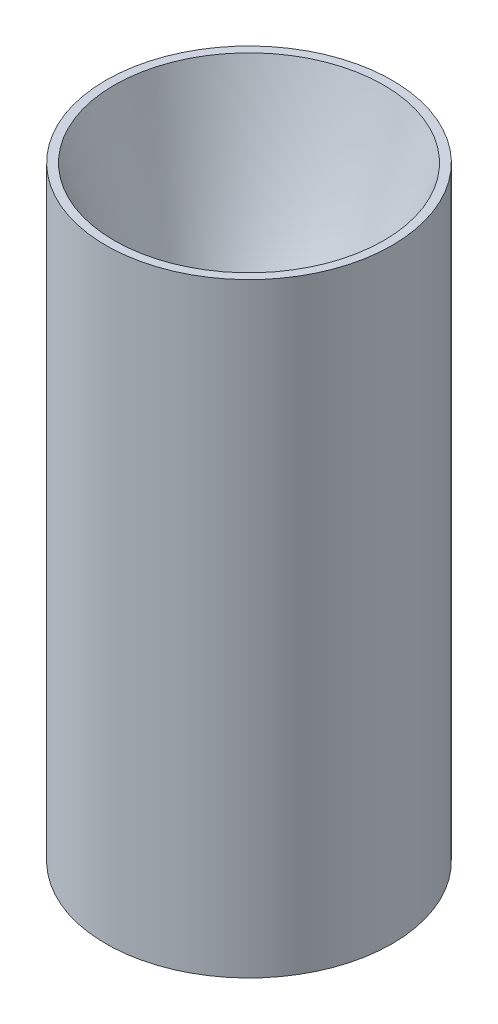
ISO-10303-21;
HEADER;
FILE_DESCRIPTION(('STEP AP214'),'2;1');
FILE_NAME('part.step','',(''),(''),'','','');
FILE_SCHEMA(('AUTOMOTIVE_DESIGN { 1 0 10303 214 1 1 1 1 }'));
ENDSEC;
DATA;
#1=APPLICATION_CONTEXT('core data for automotive mechanical design processes');
#2=APPLICATION_PROTOCOL_DEFINITION('international standard','automotive_design',2000,#1);
#3=PRODUCT_CONTEXT('',#1,'mechanical');
#4=PRODUCT('Part','Part','',(#3));
#5=PRODUCT_RELATED_PRODUCT_CATEGORY('part','',(#4));
#6=PRODUCT_DEFINITION_FORMATION('','',#4);
#7=PRODUCT_DEFINITION_CONTEXT('part definition',#1,'design');
#8=PRODUCT_DEFINITION('design','',#6,#7);
#9=PRODUCT_DEFINITION_SHAPE('','',#8);
#10=(LENGTH_UNIT() NAMED_UNIT(*) SI_UNIT(.MILLI.,.METRE.));
#11=(NAMED_UNIT(*) PLANE_ANGLE_UNIT() SI_UNIT($,.RADIAN.));
#12=(NAMED_UNIT(*) SI_UNIT($,.STERADIAN.) SOLID_ANGLE_UNIT());
#13=UNCERTAINTY_MEASURE_WITH_UNIT(LENGTH_MEASURE(1.E-05),#10,'distance_accuracy_value','');
#14=(GEOMETRIC_REPRESENTATION_CONTEXT(3) GLOBAL_UNCERTAINTY_ASSIGNED_CONTEXT((#13)) GLOBAL_UNIT_ASSIGNED_CONTEXT((#10,
#11,#12)) REPRESENTATION_CONTEXT('',''));
#15=CARTESIAN_POINT('',(0.,0.,0.));
#16=DIRECTION('',(0.,0.,1.));
#17=DIRECTION('',(1.,0.,0.));
#18=AXIS2_PLACEMENT_3D('',#15,#16,#17);
#19=CARTESIAN_POINT('',(26.7952792027638,6.50940032261705,0.));
#20=CARTESIAN_POINT('',(26.7445202608389,6.45863951352258,0.));
#21=CARTESIAN_POINT('',(26.6704420702071,6.38228245129657,0.));
#22=CARTESIAN_POINT('',(26.5045552478799,6.20880231838131,0.));
#23=CARTESIAN_POINT('',(26.3663457558084,6.0501123088261,0.));
#24=CARTESIAN_POINT('',(26.1788763741962,5.83307431955689,0.));
#25=CARTESIAN_POINT('',(26.0044054743904,5.61088821502492,0.));
#26=CARTESIAN_POINT('',(25.7917882699891,5.32567960819241,0.));
#27=CARTESIAN_POINT('',(25.6025147209982,5.0458645334822,0.));
#28=CARTESIAN_POINT('',(25.41648850457,4.75146224774109,0.));
#29=CARTESIAN_POINT('',(25.2460122224941,4.45494379501456,0.));
#30=CARTESIAN_POINT('',(25.0840703005529,4.14944285659226,0.));
#31=CARTESIAN_POINT('',(24.935285976811,3.8398274049797,0.));
#32=CARTESIAN_POINT('',(24.7971967711735,3.52378782945289,0.));
#33=CARTESIAN_POINT('',(24.6716190705559,3.20350771325653,0.));
#34=CARTESIAN_POINT('',(24.5577414131155,2.87825331698411,0.));
#35=CARTESIAN_POINT('',(24.4563235712815,2.54940009295196,0.));
#36=CARTESIAN_POINT('',(24.3671416013245,2.21651509223236,0.));
#37=CARTESIAN_POINT('',(24.2905437014453,1.88115744920019,0.));
#38=CARTESIAN_POINT('',(24.2264993053653,1.54221117006489,0.));
#39=CARTESIAN_POINT('',(24.1751847188441,1.20269794512489,0.));
#40=CARTESIAN_POINT('',(24.1414350870908,0.90159400009664,0.));
#41=CARTESIAN_POINT('',(24.1205335987741,0.646924938525799,0.));
#42=CARTESIAN_POINT('',(24.1084615678794,0.427224789349872,0.));
#43=CARTESIAN_POINT('',(24.1020237227721,0.267801741635842,0.));
#44=CARTESIAN_POINT('',(24.099606331446,0.110274361763279,0.));
#45=CARTESIAN_POINT('',(24.0990685004946,0.0360533244193808,0.));
#46=CARTESIAN_POINT('',(24.0990678740505,0.000160672239889663,0.));
#47=B_SPLINE_CURVE_WITH_KNOTS('',4,(#19,#20,#21,#22,#23,#24,#25,#26,#27,#28,#29,#30,#31,#32,#33,
#34,#35,#36,#37,#38,#39,#40,#41,#42,#43,#44,#45,#46),.UNSPECIFIED.,.F.,.F.,(5,1,1,1,1,1,1,1,1,1,
1,1,1,1,1,1,1,1,1,1,1,1,1,1,5),(0.0825688161645696,0.122284452541055,0.142142270729318,
0.162000088917581,0.201715725294151,0.241431361670644,0.281146998047181,0.320862634423759,
0.360578270800262,0.400293907176806,0.440009543553384,0.479725179929891,0.519440816306429,
0.55915645268299,0.598872089059496,0.638587725436031,0.678303361812587,0.718018998189109,
0.75773463456565,0.797450270942201,0.837165907318734,0.857023725507005,0.876881543695275,
0.896739361883545,0.916597180071815),.UNSPECIFIED.);
#48=CARTESIAN_POINT('',(-0.00553212594954357,165.815985113531,0.));
#49=DIRECTION('',(0.,1.,0.));
#50=AXIS1_PLACEMENT('',#48,#49);
#51=SURFACE_OF_REVOLUTION('',#47,#50);
#52=CARTESIAN_POINT('',(-0.00553212594953341,0.000160668663540253,0.));
#53=DIRECTION('',(0.,1.,0.));
#54=DIRECTION('',(-1.,0.,0.));
#55=AXIS2_PLACEMENT_3D('',#52,#53,#54);
#56=CIRCLE('',#55,24.1046000000004);
#57=CARTESIAN_POINT('',(-24.1101321259499,0.000160668663538777,0.));
#58=VERTEX_POINT('',#57);
#59=EDGE_CURVE('E11',#58,#58,#56,.T.);
#60=ORIENTED_EDGE('',*,*,#59,.F.);
#61=EDGE_LOOP('',(#60));
#62=FACE_BOUND('',#61,.T.);
#63=CARTESIAN_POINT('',(-0.00553212594953381,6.50940032262817,0.));
#64=DIRECTION('',(0.,1.,0.));
#65=DIRECTION('',(-1.,0.,0.));
#66=AXIS2_PLACEMENT_3D('',#63,#64,#65);
#67=CIRCLE('',#66,26.8008113287013);
#68=CARTESIAN_POINT('',(-26.8063434546508,6.50940032262817,0.));
#69=VERTEX_POINT('',#68);
#70=EDGE_CURVE('E133',#69,#69,#67,.T.);
#71=ORIENTED_EDGE('',*,*,#70,.T.);
#72=EDGE_LOOP('',(#71));
#73=FACE_BOUND('',#72,.T.);
#74=ADVANCED_FACE('F39',(#62,#73),#51,.T.);
#75=CARTESIAN_POINT('',(24.0990678740508,0.000160668663551339,0.));
#76=CARTESIAN_POINT('',(24.0990691047269,-0.070367973878569,0.));
#77=CARTESIAN_POINT('',(24.099598251825,-0.213423516507926,0.));
#78=CARTESIAN_POINT('',(24.101973936858,-0.543022242706955,0.));
#79=CARTESIAN_POINT('',(24.1082983309105,-0.823999723448026,0.));
#80=CARTESIAN_POINT('',(24.1177834518181,-1.19466139837465,0.));
#81=CARTESIAN_POINT('',(24.1304257444827,-1.51327438499646,0.));
#82=CARTESIAN_POINT('',(24.1462259682204,-1.86177892994199,0.));
#83=CARTESIAN_POINT('',(24.1651812265647,-2.19354619851658,0.));
#84=CARTESIAN_POINT('',(24.1928188405006,-2.61790872671156,0.));
#85=CARTESIAN_POINT('',(24.2322870469807,-3.12187327370256,0.));
#86=CARTESIAN_POINT('',(24.3032997069456,-3.87981800198978,0.));
#87=CARTESIAN_POINT('',(24.4231266778326,-4.88628971555583,0.));
#88=CARTESIAN_POINT('',(24.5994860436667,-6.05655008815833,0.));
#89=CARTESIAN_POINT('',(24.850885232735,-7.38500574321532,0.));
#90=CARTESIAN_POINT('',(25.1517953131182,-8.7034138436264,0.));
#91=CARTESIAN_POINT('',(25.5017706231745,-10.0094765385454,0.));
#92=CARTESIAN_POINT('',(25.9003609832821,-11.3016589275196,0.));
#93=CARTESIAN_POINT('',(26.3469453916183,-12.5779386667968,0.));
#94=CARTESIAN_POINT('',(26.8410033226009,-13.8367268169819,0.));
#95=CARTESIAN_POINT('',(27.3816731217584,-15.0760364630132,0.));
#96=CARTESIAN_POINT('',(27.9684793865051,-16.2944491293409,0.));
#97=CARTESIAN_POINT('',(28.600139397597,-17.4897781309074,0.));
#98=CARTESIAN_POINT('',(29.2765323958535,-18.6611270955555,0.));
#99=CARTESIAN_POINT('',(29.9954451018809,-19.8055827366556,0.));
#100=CARTESIAN_POINT('',(30.7580219994662,-20.9236994166732,0.));
#101=CARTESIAN_POINT('',(31.459167192691,-21.8742511037876,0.));
#102=CARTESIAN_POINT('',(32.088736123084,-22.6732848254345,0.));
#103=CARTESIAN_POINT('',(32.6241284164947,-23.3202614844282,0.));
#104=CARTESIAN_POINT('',(33.0722557681744,-23.8398443637357,0.));
#105=CARTESIAN_POINT('',(33.508450026224,-24.3296555944729,0.));
#106=CARTESIAN_POINT('',(33.9358261214135,-24.7883237390149,0.));
#107=CARTESIAN_POINT('',(34.2455586398419,-25.1137076601529,0.));
#108=CARTESIAN_POINT('',(34.5368599576458,-25.4094883974469,0.));
#109=CARTESIAN_POINT('',(34.6364124255998,-25.5097892829585,0.));
#110=CARTESIAN_POINT('',(34.6862828033089,-25.5596614680671,0.));
#111=B_SPLINE_CURVE_WITH_KNOTS('',4,(#75,#76,#77,#78,#79,#80,#81,#82,#83,#84,#85,#86,#87,#88,
#89,#90,#91,#92,#93,#94,#95,#96,#97,#98,#99,#100,#101,#102,#103,#104,#105,#106,#107,#108,#109,
#110),.UNSPECIFIED.,.F.,.F.,(5,1,1,1,1,1,1,1,1,1,1,1,1,1,1,1,1,1,1,1,1,1,1,1,1,1,1,1,1,1,1,1,5),
(0.0826377293913405,0.0925749264345495,0.10251212335078,0.11244932026701,0.122386517183241,
0.132323714099471,0.142260911015702,0.152198107931932,0.162135304848163,0.182009698680624,
0.201884092513085,0.241632880178006,0.281381667842927,0.321130455507848,0.360879243172768,
0.400628030837689,0.44037681850261,0.480125606167531,0.519874393832452,0.559623181497373,
0.599371969162294,0.639120756827214,0.678869544492136,0.718618332157059,0.758367119821983,
0.798115907486907,0.817990301319368,0.837864695151829,0.857739088984291,0.877613482816753,
0.897487876649217,0.907425073565449,0.917362270352413),.UNSPECIFIED.);
#112=CARTESIAN_POINT('',(-0.00553212594954357,165.815985113531,0.));
#113=DIRECTION('',(0.,1.,0.));
#114=AXIS1_PLACEMENT('',#112,#113);
#115=SURFACE_OF_REVOLUTION('',#111,#114);
#116=CARTESIAN_POINT('',(-0.00553212594953185,-25.5596614655478,0.));
#117=DIRECTION('',(0.,1.,0.));
#118=DIRECTION('',(-1.,0.,0.));
#119=AXIS2_PLACEMENT_3D('',#116,#117,#118);
#120=CIRCLE('',#119,34.6918149267067);
#121=CARTESIAN_POINT('',(-34.6973470526563,-25.5596614655478,0.));
#122=VERTEX_POINT('',#121);
#123=EDGE_CURVE('E48',#122,#122,#120,.T.);
#124=ORIENTED_EDGE('',*,*,#123,.F.);
#125=EDGE_LOOP('',(#124));
#126=FACE_BOUND('',#125,.T.);
#127=ORIENTED_EDGE('',*,*,#59,.T.);
#128=EDGE_LOOP('',(#127));
#129=FACE_BOUND('',#128,.T.);
#130=ADVANCED_FACE('F152',(#126,#129),#115,.T.);
#131=CARTESIAN_POINT('',(-0.00553212594953185,-25.5596614655478,0.));
#132=DIRECTION('',(0.,-1.,0.));
#133=DIRECTION('',(1.,0.,0.));
#134=AXIS2_PLACEMENT_3D('',#131,#132,#133);
#135=CONICAL_SURFACE('',#134,34.6918149267067,0.785398163436937);
#136=CARTESIAN_POINT('',(-0.00553212594953132,-34.1672896560324,0.));
#137=DIRECTION('',(0.,1.,0.));
#138=DIRECTION('',(-1.,0.,0.));
#139=AXIS2_PLACEMENT_3D('',#136,#137,#138);
#140=CIRCLE('',#139,43.2994431178712);
#141=CARTESIAN_POINT('',(-43.3049752438207,-34.1672896560324,0.));
#142=VERTEX_POINT('',#141);
#143=EDGE_CURVE('E210',#142,#142,#140,.T.);
#144=ORIENTED_EDGE('',*,*,#143,.F.);
#145=EDGE_LOOP('',(#144));
#146=FACE_BOUND('',#145,.T.);
#147=ORIENTED_EDGE('',*,*,#123,.T.);
#148=EDGE_LOOP('',(#147));
#149=FACE_BOUND('',#148,.T.);
#150=ADVANCED_FACE('F155',(#146,#149),#135,.F.);
#151=CARTESIAN_POINT('',(43.2939109919216,-34.1672896560324,0.));
#152=CARTESIAN_POINT('',(43.3437831509401,-34.2171620547876,0.));
#153=CARTESIAN_POINT('',(43.4443920723685,-34.3185162872671,0.));
#154=CARTESIAN_POINT('',(43.6740724061853,-34.5515494504386,0.));
#155=CARTESIAN_POINT('',(43.8739246239184,-34.7603401507577,0.));
#156=CARTESIAN_POINT('',(44.1814575025702,-35.0846311847488,0.));
#157=CARTESIAN_POINT('',(44.5147761894283,-35.446992656778,0.));
#158=CARTESIAN_POINT('',(44.915126947852,-35.8942476322047,0.));
#159=CARTESIAN_POINT('',(45.3528176802111,-36.4033812816733,0.));
#160=CARTESIAN_POINT('',(45.8935379369539,-37.0556721220805,0.));
#161=CARTESIAN_POINT('',(46.5198690600385,-37.8514517846419,0.));
#162=CARTESIAN_POINT('',(47.2231021376954,-38.8040762386625,0.));
#163=CARTESIAN_POINT('',(47.9844755193302,-39.9209726566969,0.));
#164=CARTESIAN_POINT('',(48.7041252285222,-41.0661548784852,0.));
#165=CARTESIAN_POINT('',(49.3801202302703,-42.2370932384946,0.));
#166=CARTESIAN_POINT('',(50.01206092747,-43.4327015254174,0.));
#167=CARTESIAN_POINT('',(50.5987337523159,-44.6509688031028,0.));
#168=CARTESIAN_POINT('',(51.1395203606863,-45.8904084049121,0.));
#169=CARTESIAN_POINT('',(51.6335378307226,-47.1491350666163,0.));
#170=CARTESIAN_POINT('',(52.0243487389992,-48.2659692231615,0.));
#171=CARTESIAN_POINT('',(52.3292893400894,-49.2330777397246,0.));
#172=CARTESIAN_POINT('',(52.6100142241289,-50.2074890377158,0.));
#173=CARTESIAN_POINT('',(52.8663751201,-51.1885390829049,0.));
#174=CARTESIAN_POINT('',(53.0920641867515,-52.1774428208328,0.));
#175=CARTESIAN_POINT('',(53.2868108220631,-53.1724252392928,0.));
#176=CARTESIAN_POINT('',(53.4566757862058,-54.1724354297311,0.));
#177=CARTESIAN_POINT('',(53.5774268612799,-55.0081658598712,0.));
#178=CARTESIAN_POINT('',(53.6772884516445,-55.8484803652905,0.));
#179=CARTESIAN_POINT('',(53.7561931213628,-56.6879981646496,0.));
#180=CARTESIAN_POINT('',(53.8004052845922,-57.2809598986136,0.));
#181=CARTESIAN_POINT('',(53.8304176255593,-57.7815944421289,0.));
#182=CARTESIAN_POINT('',(53.85016845335,-58.2128376212103,0.));
#183=CARTESIAN_POINT('',(53.8628113509135,-58.5325674871425,0.));
#184=CARTESIAN_POINT('',(53.8722968379942,-58.904795492133,0.));
#185=CARTESIAN_POINT('',(53.8786214368583,-59.1815646159098,0.));
#186=CARTESIAN_POINT('',(53.8809972871415,-59.5154061023805,0.));
#187=CARTESIAN_POINT('',(53.8815264301106,-59.656983156036,0.));
#188=CARTESIAN_POINT('',(53.8815276614593,-59.7275132092136,0.));
#189=B_SPLINE_CURVE_WITH_KNOTS('',4,(#151,#152,#153,#154,#155,#156,#157,#158,#159,#160,#161,
#162,#163,#164,#165,#166,#167,#168,#169,#170,#171,#172,#173,#174,#175,#176,#177,#178,#179,#180,
#181,#182,#183,#184,#185,#186,#187,#188),.UNSPECIFIED.,.F.,.F.,(5,1,1,1,1,1,1,1,1,1,1,1,1,1,1,1,
1,1,1,1,1,1,1,1,1,1,1,1,1,1,1,1,1,1,5),(0.0826377290567819,0.0925749255159742,0.102512122432206,
0.112449319348439,0.122386516264671,0.142260910097132,0.162135303929593,0.182009697762054,
0.201884091594514,0.241632879259436,0.281381666924358,0.321130454589279,0.3608792422542,
0.400628029919122,0.440376817584044,0.480125605248966,0.519874392913887,0.559623180578807,
0.599371968243729,0.61924636207619,0.639120755908651,0.678869543573573,0.718618331238494,
0.738492725070955,0.758367118903416,0.798115906568337,0.817990300400798,0.837864694233258,
0.857739088065719,0.86767628498195,0.87761348189818,0.887550678814411,0.897487875730641,
0.907425072646872,0.917362270024638),.UNSPECIFIED.);
#190=CARTESIAN_POINT('',(-0.00553212594954357,165.815985113531,0.));
#191=DIRECTION('',(0.,1.,0.));
#192=AXIS1_PLACEMENT('',#190,#191);
#193=SURFACE_OF_REVOLUTION('',#189,#192);
#194=CARTESIAN_POINT('',(-0.00553212594952976,-59.7275132222084,0.));
#195=DIRECTION('',(0.,1.,0.));
#196=DIRECTION('',(-1.,0.,0.));
#197=AXIS2_PLACEMENT_3D('',#194,#195,#196);
#198=CIRCLE('',#197,53.8870597874087);
#199=CARTESIAN_POINT('',(-53.8925919133582,-59.7275132222084,0.));
#200=VERTEX_POINT('',#199);
#201=EDGE_CURVE('E207',#200,#200,#198,.T.);
#202=ORIENTED_EDGE('',*,*,#201,.F.);
#203=EDGE_LOOP('',(#202));
#204=FACE_BOUND('',#203,.T.);
#205=ORIENTED_EDGE('',*,*,#143,.T.);
#206=EDGE_LOOP('',(#205));
#207=FACE_BOUND('',#206,.T.);
#208=ADVANCED_FACE('F159',(#204,#207),#193,.T.);
#209=CARTESIAN_POINT('',(-0.00553212594954357,165.815985113531,0.));
#210=DIRECTION('',(0.,1.,0.));
#211=DIRECTION('',(-1.,0.,0.));
#212=AXIS2_PLACEMENT_3D('',#209,#210,#211);
#213=CYLINDRICAL_SURFACE('',#212,53.8870597874087);
#214=CARTESIAN_POINT('',(-0.00553212594952042,-212.127513222208,0.));
#215=DIRECTION('',(0.,1.,0.));
#216=DIRECTION('',(-1.,0.,0.));
#217=AXIS2_PLACEMENT_3D('',#214,#215,#216);
#218=CIRCLE('',#217,53.8870597874087);
#219=CARTESIAN_POINT('',(-53.8925919133582,-212.127513222208,0.));
#220=VERTEX_POINT('',#219);
#221=EDGE_CURVE('E204',#220,#220,#218,.T.);
#222=ORIENTED_EDGE('',*,*,#221,.F.);
#223=EDGE_LOOP('',(#222));
#224=FACE_BOUND('',#223,.T.);
#225=ORIENTED_EDGE('',*,*,#201,.T.);
#226=EDGE_LOOP('',(#225));
#227=FACE_BOUND('',#226,.T.);
#228=ADVANCED_FACE('F163',(#224,#227),#213,.F.);
#229=CARTESIAN_POINT('',(76.1944678740507,-212.127513222208,0.));
#230=DIRECTION('',(0.,1.,0.));
#231=DIRECTION('',(-1.,0.,0.));
#232=AXIS2_PLACEMENT_3D('',#229,#230,#231);
#233=PLANE('',#232);
#234=CARTESIAN_POINT('',(-60.2370592497475,-212.127513222208,24.9506852198973));
#235=DIRECTION('',(0.,-1.,0.));
#236=DIRECTION('',(0.,0.,-1.));
#237=AXIS2_PLACEMENT_3D('',#234,#235,#236);
#238=CIRCLE('',#237,3.17499999999999);
#239=CARTESIAN_POINT('',(-60.2370592497475,-212.127513222208,21.7756852198974));
#240=VERTEX_POINT('',#239);
#241=EDGE_CURVE('E91',#240,#240,#238,.T.);
#242=ORIENTED_EDGE('',*,*,#241,.F.);
#243=EDGE_LOOP('',(#242));
#244=FACE_BOUND('',#243,.T.);
#245=CARTESIAN_POINT('',(60.236831783612,-212.127513222208,-24.9512343717267));
#246=DIRECTION('',(0.,-1.,0.));
#247=DIRECTION('',(0.,0.,-1.));
#248=AXIS2_PLACEMENT_3D('',#245,#246,#247);
#249=CIRCLE('',#248,3.17499999999998);
#250=CARTESIAN_POINT('',(60.236831783612,-212.127513222208,-28.1262343717266));
#251=VERTEX_POINT('',#250);
#252=EDGE_CURVE('E90',#251,#251,#249,.T.);
#253=ORIENTED_EDGE('',*,*,#252,.F.);
#254=EDGE_LOOP('',(#253));
#255=FACE_BOUND('',#254,.T.);
#256=CARTESIAN_POINT('',(46.1032838079609,-212.127513222208,46.1035512337718));
#257=DIRECTION('',(0.,1.,0.));
#258=DIRECTION('',(0.38268343232144,0.,-0.923879532529367));
#259=AXIS2_PLACEMENT_3D('',#256,#257,#258);
#260=ELLIPSE('',#259,4.21640000033001,4.21639999999999);
#261=CARTESIAN_POINT('',(47.7168302321273,-212.127513222208,42.20810557251));
#262=VERTEX_POINT('',#261);
#263=EDGE_CURVE('E43',#262,#262,#260,.T.);
#264=ORIENTED_EDGE('',*,*,#263,.T.);
#265=EDGE_LOOP('',(#264));
#266=FACE_BOUND('',#265,.T.);
#267=CARTESIAN_POINT('',(-0.000267431971473179,-212.127513222208,65.2002674406839));
#268=DIRECTION('',(0.,1.,0.));
#269=DIRECTION('',(0.707106781139304,0.,-0.707106781233791));
#270=AXIS2_PLACEMENT_3D('',#267,#268,#269);
#271=ELLIPSE('',#270,4.21640000112674,4.21639999999999);
#272=CARTESIAN_POINT('',(2.98117760082102,-212.127513222208,62.2188224074931));
#273=VERTEX_POINT('',#272);
#274=EDGE_CURVE('E107',#273,#273,#271,.T.);
#275=ORIENTED_EDGE('',*,*,#274,.T.);
#276=EDGE_LOOP('',(#275));
#277=FACE_BOUND('',#276,.T.);
#278=CARTESIAN_POINT('',(-46.1038186893277,-212.127513222208,46.1035512511962));
#279=DIRECTION('',(0.,1.,0.));
#280=DIRECTION('',(0.923879532493207,0.,-0.382683432408738));
#281=AXIS2_PLACEMENT_3D('',#278,#279,#280);
#282=ELLIPSE('',#281,4.21640000192348,4.21639999999999);
#283=CARTESIAN_POINT('',(-42.2083730267463,-212.127513222208,44.4900048260519));
#284=VERTEX_POINT('',#283);
#285=EDGE_CURVE('E111',#284,#284,#282,.T.);
#286=ORIENTED_EDGE('',*,*,#285,.T.);
#287=EDGE_LOOP('',(#286));
#288=FACE_BOUND('',#287,.T.);
#289=CARTESIAN_POINT('',(-65.2005348987914,-212.127513222208,0.));
#290=DIRECTION('',(0.,1.,0.));
#291=DIRECTION('',(1.,0.,0.));
#292=AXIS2_PLACEMENT_3D('',#289,#290,#291);
#293=ELLIPSE('',#292,4.21640000225349,4.21639999999999);
#294=CARTESIAN_POINT('',(-60.9841348965379,-212.127513222208,0.));
#295=VERTEX_POINT('',#294);
#296=EDGE_CURVE('E115',#295,#295,#293,.T.);
#297=ORIENTED_EDGE('',*,*,#296,.T.);
#298=EDGE_LOOP('',(#297));
#299=FACE_BOUND('',#298,.T.);
#300=CARTESIAN_POINT('',(-46.1038186893284,-212.127513222208,-46.1035512511956));
#301=DIRECTION('',(0.,1.,0.));
#302=DIRECTION('',(0.92387953249321,0.,0.382683432408731));
#303=AXIS2_PLACEMENT_3D('',#300,#301,#302);
#304=ELLIPSE('',#303,4.21640000192348,4.21639999999999);
#305=CARTESIAN_POINT('',(-42.2083730267469,-212.127513222208,-44.4900048260513));
#306=VERTEX_POINT('',#305);
#307=EDGE_CURVE('E119',#306,#306,#304,.T.);
#308=ORIENTED_EDGE('',*,*,#307,.T.);
#309=EDGE_LOOP('',(#308));
#310=FACE_BOUND('',#309,.T.);
#311=CARTESIAN_POINT('',(-0.000267431972383761,-212.127513222208,-65.2002674406839));
#312=DIRECTION('',(0.,1.,0.));
#313=DIRECTION('',(0.707106781139309,0.,0.707106781233786));
#314=AXIS2_PLACEMENT_3D('',#311,#312,#313);
#315=ELLIPSE('',#314,4.21640000112674,4.21639999999999);
#316=CARTESIAN_POINT('',(2.98117760082012,-212.127513222208,-62.2188224074931));
#317=VERTEX_POINT('',#316);
#318=EDGE_CURVE('E123',#317,#317,#315,.T.);
#319=ORIENTED_EDGE('',*,*,#318,.T.);
#320=EDGE_LOOP('',(#319));
#321=FACE_BOUND('',#320,.T.);
#322=CARTESIAN_POINT('',(46.1032838079602,-212.127513222208,-46.1035512337724));
#323=DIRECTION('',(0.,1.,0.));
#324=DIRECTION('',(0.382683432321446,0.,0.923879532529364));
#325=AXIS2_PLACEMENT_3D('',#322,#323,#324);
#326=ELLIPSE('',#325,4.21640000033001,4.21639999999999);
#327=CARTESIAN_POINT('',(47.7168302321267,-212.127513222208,-42.2081055725107));
#328=VERTEX_POINT('',#327);
#329=EDGE_CURVE('E127',#328,#328,#326,.T.);
#330=ORIENTED_EDGE('',*,*,#329,.T.);
#331=EDGE_LOOP('',(#330));
#332=FACE_BOUND('',#331,.T.);
#333=CARTESIAN_POINT('',(65.2,-212.127513222208,0.));
#334=DIRECTION('',(0.,-1.,0.));
#335=DIRECTION('',(0.,0.,-1.));
#336=AXIS2_PLACEMENT_3D('',#333,#334,#335);
#337=CIRCLE('',#336,4.21639999999999);
#338=CARTESIAN_POINT('',(65.2,-212.127513222208,-4.21639999999999));
#339=VERTEX_POINT('',#338);
#340=EDGE_CURVE('E128',#339,#339,#337,.T.);
#341=ORIENTED_EDGE('',*,*,#340,.F.);
#342=EDGE_LOOP('',(#341));
#343=FACE_BOUND('',#342,.T.);
#344=CARTESIAN_POINT('',(-0.00553212594952042,-212.127513222208,0.));
#345=DIRECTION('',(0.,1.,0.));
#346=DIRECTION('',(-1.,0.,0.));
#347=AXIS2_PLACEMENT_3D('',#344,#345,#346);
#348=CIRCLE('',#347,76.2000000000002);
#349=CARTESIAN_POINT('',(-76.2055321259497,-212.127513222208,0.));
#350=VERTEX_POINT('',#349);
#351=EDGE_CURVE('E201',#350,#350,#348,.T.);
#352=ORIENTED_EDGE('',*,*,#351,.F.);
#353=EDGE_LOOP('',(#352));
#354=FACE_BOUND('',#353,.T.);
#355=ORIENTED_EDGE('',*,*,#221,.T.);
#356=EDGE_LOOP('',(#355));
#357=FACE_BOUND('',#356,.T.);
#358=ADVANCED_FACE('F167',(#244,#255,#266,#277,#288,#299,#310,#321,#332,#343,#354,#357),#233,.F.);
#359=CARTESIAN_POINT('',(-0.00553212594954357,165.815985113531,0.));
#360=DIRECTION('',(0.,1.,0.));
#361=DIRECTION('',(-1.,0.,0.));
#362=AXIS2_PLACEMENT_3D('',#359,#360,#361);
#363=CYLINDRICAL_SURFACE('',#362,76.2000000000002);
#364=CARTESIAN_POINT('',(-0.00553212594954014,109.927507640521,0.));
#365=DIRECTION('',(0.,1.,0.));
#366=DIRECTION('',(-1.,0.,0.));
#367=AXIS2_PLACEMENT_3D('',#364,#365,#366);
#368=CIRCLE('',#367,76.2000000000002);
#369=CARTESIAN_POINT('',(-76.2055321259497,109.927507640521,0.));
#370=VERTEX_POINT('',#369);
#371=EDGE_CURVE('E198',#370,#370,#368,.T.);
#372=ORIENTED_EDGE('',*,*,#371,.F.);
#373=EDGE_LOOP('',(#372));
#374=FACE_BOUND('',#373,.T.);
#375=ORIENTED_EDGE('',*,*,#351,.T.);
#376=EDGE_LOOP('',(#375));
#377=FACE_BOUND('',#376,.T.);
#378=ADVANCED_FACE('F171',(#374,#377),#363,.T.);
#379=CARTESIAN_POINT('',(71.7275236023104,109.927507640521,0.));
#380=DIRECTION('',(0.,-1.,0.));
#381=DIRECTION('',(1.,0.,0.));
#382=AXIS2_PLACEMENT_3D('',#379,#380,#381);
#383=PLANE('',#382);
#384=CARTESIAN_POINT('',(-0.00553212594954014,109.927507640521,0.));
#385=DIRECTION('',(0.,1.,0.));
#386=DIRECTION('',(-1.,0.,0.));
#387=AXIS2_PLACEMENT_3D('',#384,#385,#386);
#388=CIRCLE('',#387,71.7330557282631);
#389=CARTESIAN_POINT('',(-71.7385878542127,109.927507640521,0.));
#390=VERTEX_POINT('',#389);
#391=EDGE_CURVE('E195',#390,#390,#388,.T.);
#392=ORIENTED_EDGE('',*,*,#391,.F.);
#393=EDGE_LOOP('',(#392));
#394=FACE_BOUND('',#393,.T.);
#395=ORIENTED_EDGE('',*,*,#371,.T.);
#396=EDGE_LOOP('',(#395));
#397=FACE_BOUND('',#396,.T.);
#398=ADVANCED_FACE('F175',(#394,#397),#383,.F.);
#399=CARTESIAN_POINT('',(71.7275236023136,109.927507640521,0.));
#400=CARTESIAN_POINT('',(49.2614014026326,34.6361148417871,0.));
#401=CARTESIAN_POINT('',(26.7952792027517,6.50940032262818,0.));
#402=B_SPLINE_CURVE_WITH_KNOTS('',2,(#399,#400,#401),.UNSPECIFIED.,.F.,.F.,(3,3),(0.,1.),.UNSPECIFIED.);
#403=CARTESIAN_POINT('',(-0.00553212594954357,165.815985113531,0.));
#404=DIRECTION('',(0.,1.,0.));
#405=AXIS1_PLACEMENT('',#403,#404);
#406=SURFACE_OF_REVOLUTION('',#402,#405);
#407=ORIENTED_EDGE('',*,*,#70,.F.);
#408=EDGE_LOOP('',(#407));
#409=FACE_BOUND('',#408,.T.);
#410=ORIENTED_EDGE('',*,*,#391,.T.);
#411=EDGE_LOOP('',(#410));
#412=FACE_BOUND('',#411,.T.);
#413=ADVANCED_FACE('F179',(#409,#412),#406,.T.);
#414=CARTESIAN_POINT('',(65.2,-187.127513222208,0.));
#415=DIRECTION('',(0.,-1.,0.));
#416=DIRECTION('',(0.,0.,-1.));
#417=AXIS2_PLACEMENT_3D('',#414,#415,#416);
#418=CONICAL_SURFACE('',#417,4.21639999999999,1.02974425867665);
#419=CARTESIAN_POINT('',(65.2,-184.594044508141,0.));
#420=VERTEX_POINT('',#419);
#421=VERTEX_LOOP('',#420);
#422=FACE_BOUND('',#421,.T.);
#423=CARTESIAN_POINT('',(65.2,-187.127513222208,0.));
#424=DIRECTION('',(0.,-1.,0.));
#425=DIRECTION('',(0.,0.,-1.));
#426=AXIS2_PLACEMENT_3D('',#423,#424,#425);
#427=CIRCLE('',#426,4.21639999999999);
#428=CARTESIAN_POINT('',(65.2,-187.127513222208,-4.21639999999999));
#429=VERTEX_POINT('',#428);
#430=EDGE_CURVE('E131',#429,#429,#427,.T.);
#431=ORIENTED_EDGE('',*,*,#430,.T.);
#432=EDGE_LOOP('',(#431));
#433=FACE_BOUND('',#432,.T.);
#434=ADVANCED_FACE('F183',(#422,#433),#418,.F.);
#435=CARTESIAN_POINT('',(65.2,-212.127513222208,0.));
#436=DIRECTION('',(0.,-1.,0.));
#437=DIRECTION('',(0.,0.,-1.));
#438=AXIS2_PLACEMENT_3D('',#435,#436,#437);
#439=CYLINDRICAL_SURFACE('',#438,4.21639999999999);
#440=ORIENTED_EDGE('',*,*,#430,.F.);
#441=EDGE_LOOP('',(#440));
#442=FACE_BOUND('',#441,.T.);
#443=ORIENTED_EDGE('',*,*,#340,.T.);
#444=EDGE_LOOP('',(#443));
#445=FACE_BOUND('',#444,.T.);
#446=ADVANCED_FACE('F314',(#442,#445),#439,.F.);
#447=CARTESIAN_POINT('',(46.1032838094549,-212.127825399818,-46.1035512301639));
#448=DIRECTION('',(4.78798051518147E-06,-0.99999999992173,1.15592074975258E-05));
#449=DIRECTION('',(0.,-1.15592074976583E-05,-0.999999999933193));
#450=AXIS2_PLACEMENT_3D('',#447,#448,#449);
#451=CYLINDRICAL_SURFACE('',#450,4.21639999999999);
#452=CARTESIAN_POINT('',(46.103164109942,-187.127825401775,-46.1038402103513));
#453=DIRECTION('',(4.78798051518147E-06,-0.99999999992173,1.15592074975258E-05));
#454=DIRECTION('',(0.,-1.15592074976583E-05,-0.999999999933193));
#455=AXIS2_PLACEMENT_3D('',#452,#453,#454);
#456=CIRCLE('',#455,4.2164);
#457=CARTESIAN_POINT('',(46.103164109942,-187.127874140018,-50.3202402100696));
#458=VERTEX_POINT('',#457);
#459=EDGE_CURVE('E124',#458,#458,#456,.T.);
#460=ORIENTED_EDGE('',*,*,#459,.F.);
#461=EDGE_LOOP('',(#460));
#462=FACE_BOUND('',#461,.T.);
#463=ORIENTED_EDGE('',*,*,#329,.F.);
#464=EDGE_LOOP('',(#463));
#465=FACE_BOUND('',#464,.T.);
#466=ADVANCED_FACE('F321',(#462,#465),#451,.F.);
#467=CARTESIAN_POINT('',(46.103164109942,-187.127825401775,-46.1038402103513));
#468=DIRECTION('',(4.78798051518147E-06,-0.99999999992173,1.15592074975258E-05));
#469=DIRECTION('',(0.,-1.15592074976583E-05,-0.999999999933193));
#470=AXIS2_PLACEMENT_3D('',#467,#468,#469);
#471=CONICAL_SURFACE('',#470,4.2164,1.02974425867665);
#472=CARTESIAN_POINT('',(46.1031519797432,-184.594356687906,-46.1038694952419));
#473=VERTEX_POINT('',#472);
#474=VERTEX_LOOP('',#473);
#475=FACE_BOUND('',#474,.T.);
#476=ORIENTED_EDGE('',*,*,#459,.T.);
#477=EDGE_LOOP('',(#476));
#478=FACE_BOUND('',#477,.T.);
#479=ADVANCED_FACE('F330',(#475,#478),#471,.F.);
#480=CARTESIAN_POINT('',(-0.000267414548880048,-212.128579063238,-65.2002674232604));
#481=DIRECTION('',(1.63471880111628E-05,-0.99999999973277,1.63471880132858E-05));
#482=DIRECTION('',(0.,-1.634718801547E-05,-0.999999999866385));
#483=AXIS2_PLACEMENT_3D('',#480,#481,#482);
#484=CYLINDRICAL_SURFACE('',#483,4.21639999999999);
#485=CARTESIAN_POINT('',(-0.000676094249159119,-187.128579069919,-65.2006761029608));
#486=DIRECTION('',(1.63471880111628E-05,-0.99999999973277,1.63471880132858E-05));
#487=DIRECTION('',(0.,-1.634718801547E-05,-0.999999999866385));
#488=AXIS2_PLACEMENT_3D('',#485,#486,#487);
#489=CIRCLE('',#488,4.2164);
#490=CARTESIAN_POINT('',(-0.000676094249159119,-187.128647996203,-69.4170761023974));
#491=VERTEX_POINT('',#490);
#492=EDGE_CURVE('E120',#491,#491,#489,.T.);
#493=ORIENTED_EDGE('',*,*,#492,.F.);
#494=EDGE_LOOP('',(#493));
#495=FACE_BOUND('',#494,.T.);
#496=ORIENTED_EDGE('',*,*,#318,.F.);
#497=EDGE_LOOP('',(#496));
#498=FACE_BOUND('',#497,.T.);
#499=ADVANCED_FACE('F339',(#495,#498),#484,.F.);
#500=CARTESIAN_POINT('',(-0.000676094249159119,-187.128579069919,-65.2006761029608));
#501=DIRECTION('',(1.63471880111628E-05,-0.99999999973277,1.63471880132858E-05));
#502=DIRECTION('',(0.,-1.634718801547E-05,-0.999999999866385));
#503=AXIS2_PLACEMENT_3D('',#500,#501,#502);
#504=CONICAL_SURFACE('',#503,4.2164,1.02974425867666);
#505=CARTESIAN_POINT('',(-0.000717509338553153,-184.595110356528,-65.2007175180502));
#506=VERTEX_POINT('',#505);
#507=VERTEX_LOOP('',#506);
#508=FACE_BOUND('',#507,.T.);
#509=ORIENTED_EDGE('',*,*,#492,.T.);
#510=EDGE_LOOP('',(#509));
#511=FACE_BOUND('',#510,.T.);
#512=ADVANCED_FACE('F348',(#508,#511),#504,.F.);
#513=CARTESIAN_POINT('',(-46.1038186385525,-212.129332726658,-46.1035512301636));
#514=DIRECTION('',(2.79063955071442E-05,-0.999999999543809,1.15592074975258E-05));
#515=DIRECTION('',(0.999999999610617,2.79063955090085E-05,0.));
#516=AXIS2_PLACEMENT_3D('',#513,#514,#515);
#517=CYLINDRICAL_SURFACE('',#516,4.21639999999999);
#518=CARTESIAN_POINT('',(-46.1045162984402,-187.129332738063,-46.103840210351));
#519=DIRECTION('',(2.79063955071442E-05,-0.999999999543809,1.15592074975258E-05));
#520=DIRECTION('',(0.999999999610617,2.79063955090085E-05,0.));
#521=AXIS2_PLACEMENT_3D('',#518,#519,#520);
#522=CIRCLE('',#521,4.21639999999999);
#523=CARTESIAN_POINT('',(-41.888116300082,-187.129215073537,-46.103840210351));
#524=VERTEX_POINT('',#523);
#525=EDGE_CURVE('E116',#524,#524,#522,.T.);
#526=ORIENTED_EDGE('',*,*,#525,.F.);
#527=EDGE_LOOP('',(#526));
#528=FACE_BOUND('',#527,.T.);
#529=ORIENTED_EDGE('',*,*,#307,.F.);
#530=EDGE_LOOP('',(#529));
#531=FACE_BOUND('',#530,.T.);
#532=ADVANCED_FACE('F358',(#528,#531),#517,.F.);
#533=CARTESIAN_POINT('',(-46.1045162984402,-187.129332738063,-46.103840210351));
#534=DIRECTION('',(2.79063955071442E-05,-0.999999999543809,1.15592074975258E-05));
#535=DIRECTION('',(0.999999999610617,2.79063955090085E-05,0.));
#536=AXIS2_PLACEMENT_3D('',#533,#534,#535);
#537=CONICAL_SURFACE('',#536,4.21639999999999,1.02974425867665);
#538=CARTESIAN_POINT('',(-46.1045869984202,-184.595864025151,-46.1038694952416));
#539=VERTEX_POINT('',#538);
#540=VERTEX_LOOP('',#539);
#541=FACE_BOUND('',#540,.T.);
#542=ORIENTED_EDGE('',*,*,#525,.T.);
#543=EDGE_LOOP('',(#542));
#544=FACE_BOUND('',#543,.T.);
#545=ADVANCED_FACE('F366',(#541,#544),#537,.F.);
#546=CARTESIAN_POINT('',(-65.2005348290974,-212.129644904269,0.));
#547=DIRECTION('',(3.26943760222643E-05,-0.999999999465539,0.));
#548=DIRECTION('',(0.999999999465539,3.26943760222643E-05,0.));
#549=AXIS2_PLACEMENT_3D('',#546,#547,#548);
#550=CYLINDRICAL_SURFACE('',#549,4.21639999999999);
#551=CARTESIAN_POINT('',(-65.2013521884979,-187.12964491763,0.));
#552=DIRECTION('',(3.26943760222643E-05,-0.999999999465539,0.));
#553=DIRECTION('',(0.999999999465539,3.26943760222643E-05,0.));
#554=AXIS2_PLACEMENT_3D('',#551,#552,#553);
#555=CIRCLE('',#554,4.21639999999999);
#556=CARTESIAN_POINT('',(-60.9849521907514,-187.129507065063,0.));
#557=VERTEX_POINT('',#556);
#558=EDGE_CURVE('E112',#557,#557,#555,.T.);
#559=ORIENTED_EDGE('',*,*,#558,.F.);
#560=EDGE_LOOP('',(#559));
#561=FACE_BOUND('',#560,.T.);
#562=ORIENTED_EDGE('',*,*,#296,.F.);
#563=EDGE_LOOP('',(#562));
#564=FACE_BOUND('',#563,.T.);
#565=ADVANCED_FACE('F374',(#561,#564),#550,.F.);
#566=CARTESIAN_POINT('',(-65.2013521884979,-187.12964491763,0.));
#567=DIRECTION('',(3.26943760222643E-05,-0.999999999465539,0.));
#568=DIRECTION('',(0.999999999465539,3.26943760222643E-05,0.));
#569=AXIS2_PLACEMENT_3D('',#566,#567,#568);
#570=CONICAL_SURFACE('',#569,4.21639999999999,1.02974425867665);
#571=CARTESIAN_POINT('',(-65.2014350186767,-184.596176204916,0.));
#572=VERTEX_POINT('',#571);
#573=VERTEX_LOOP('',#572);
#574=FACE_BOUND('',#573,.T.);
#575=ORIENTED_EDGE('',*,*,#558,.T.);
#576=EDGE_LOOP('',(#575));
#577=FACE_BOUND('',#576,.T.);
#578=ADVANCED_FACE('F382',(#574,#577),#570,.F.);
#579=CARTESIAN_POINT('',(-46.1038186385519,-212.129332726658,46.1035512301642));
#580=DIRECTION('',(2.7906395507144E-05,-0.999999999543809,-1.15592074975259E-05));
#581=DIRECTION('',(0.999999999610617,2.79063955090084E-05,0.));
#582=AXIS2_PLACEMENT_3D('',#579,#580,#581);
#583=CYLINDRICAL_SURFACE('',#582,4.21639999999999);
#584=CARTESIAN_POINT('',(-46.1045162984396,-187.129332738063,46.1038402103516));
#585=DIRECTION('',(2.7906395507144E-05,-0.999999999543809,-1.15592074975259E-05));
#586=DIRECTION('',(0.999999999610617,2.79063955090084E-05,0.));
#587=AXIS2_PLACEMENT_3D('',#584,#585,#586);
#588=CIRCLE('',#587,4.2164);
#589=CARTESIAN_POINT('',(-41.8881163000814,-187.129215073537,46.1038402103516));
#590=VERTEX_POINT('',#589);
#591=EDGE_CURVE('E108',#590,#590,#588,.T.);
#592=ORIENTED_EDGE('',*,*,#591,.F.);
#593=EDGE_LOOP('',(#592));
#594=FACE_BOUND('',#593,.T.);
#595=ORIENTED_EDGE('',*,*,#285,.F.);
#596=EDGE_LOOP('',(#595));
#597=FACE_BOUND('',#596,.T.);
#598=ADVANCED_FACE('F242',(#594,#597),#583,.F.);
#599=CARTESIAN_POINT('',(-46.1045162984396,-187.129332738063,46.1038402103516));
#600=DIRECTION('',(2.7906395507144E-05,-0.999999999543809,-1.15592074975259E-05));
#601=DIRECTION('',(0.999999999610617,2.79063955090084E-05,0.));
#602=AXIS2_PLACEMENT_3D('',#599,#600,#601);
#603=CONICAL_SURFACE('',#602,4.2164,1.02974425867666);
#604=CARTESIAN_POINT('',(-46.1045869984195,-184.595864025151,46.1038694952422));
#605=VERTEX_POINT('',#604);
#606=VERTEX_LOOP('',#605);
#607=FACE_BOUND('',#606,.T.);
#608=ORIENTED_EDGE('',*,*,#591,.T.);
#609=EDGE_LOOP('',(#608));
#610=FACE_BOUND('',#609,.T.);
#611=ADVANCED_FACE('F232',(#607,#610),#603,.F.);
#612=CARTESIAN_POINT('',(-0.000267414547969466,-212.128579063238,65.2002674232604));
#613=DIRECTION('',(1.63471880111626E-05,-0.99999999973277,-1.63471880132858E-05));
#614=DIRECTION('',(0.,1.634718801547E-05,-0.999999999866385));
#615=AXIS2_PLACEMENT_3D('',#612,#613,#614);
#616=CYLINDRICAL_SURFACE('',#615,4.21639999999999);
#617=CARTESIAN_POINT('',(-0.000676094248248532,-187.128579069919,65.2006761029608));
#618=DIRECTION('',(1.63471880111626E-05,-0.99999999973277,-1.63471880132858E-05));
#619=DIRECTION('',(0.,1.634718801547E-05,-0.999999999866385));
#620=AXIS2_PLACEMENT_3D('',#617,#618,#619);
#621=CIRCLE('',#620,4.21639999999999);
#622=CARTESIAN_POINT('',(-0.000676094248248532,-187.128510143636,60.9842761035241));
#623=VERTEX_POINT('',#622);
#624=EDGE_CURVE('E104',#623,#623,#621,.T.);
#625=ORIENTED_EDGE('',*,*,#624,.F.);
#626=EDGE_LOOP('',(#625));
#627=FACE_BOUND('',#626,.T.);
#628=ORIENTED_EDGE('',*,*,#274,.F.);
#629=EDGE_LOOP('',(#628));
#630=FACE_BOUND('',#629,.T.);
#631=ADVANCED_FACE('F229',(#627,#630),#616,.F.);
#632=CARTESIAN_POINT('',(-0.000676094248248532,-187.128579069919,65.2006761029608));
#633=DIRECTION('',(1.63471880111626E-05,-0.99999999973277,-1.63471880132858E-05));
#634=DIRECTION('',(0.,1.634718801547E-05,-0.999999999866385));
#635=AXIS2_PLACEMENT_3D('',#632,#633,#634);
#636=CONICAL_SURFACE('',#635,4.21639999999999,1.02974425867665);
#637=CARTESIAN_POINT('',(-0.000717509337642565,-184.595110356528,65.2007175180502));
#638=VERTEX_POINT('',#637);
#639=VERTEX_LOOP('',#638);
#640=FACE_BOUND('',#639,.T.);
#641=ORIENTED_EDGE('',*,*,#624,.T.);
#642=EDGE_LOOP('',(#641));
#643=FACE_BOUND('',#642,.T.);
#644=ADVANCED_FACE('F231',(#640,#643),#636,.F.);
#645=CARTESIAN_POINT('',(46.1032838094556,-212.127825399818,46.1035512301632));
#646=DIRECTION('',(4.7879805151813E-06,-0.99999999992173,-1.15592074975257E-05));
#647=DIRECTION('',(0.,1.15592074976582E-05,-0.999999999933193));
#648=AXIS2_PLACEMENT_3D('',#645,#646,#647);
#649=CYLINDRICAL_SURFACE('',#648,4.21639999999999);
#650=CARTESIAN_POINT('',(46.1031641099427,-187.127825401775,46.1038402103507));
#651=DIRECTION('',(4.7879805151813E-06,-0.99999999992173,-1.15592074975257E-05));
#652=DIRECTION('',(0.,1.15592074976582E-05,-0.999999999933193));
#653=AXIS2_PLACEMENT_3D('',#650,#651,#652);
#654=CIRCLE('',#653,4.21639999999999);
#655=CARTESIAN_POINT('',(46.1031641099427,-187.127776663533,41.8874402106324));
#656=VERTEX_POINT('',#655);
#657=EDGE_CURVE('E101',#656,#656,#654,.T.);
#658=ORIENTED_EDGE('',*,*,#657,.F.);
#659=EDGE_LOOP('',(#658));
#660=FACE_BOUND('',#659,.T.);
#661=ORIENTED_EDGE('',*,*,#263,.F.);
#662=EDGE_LOOP('',(#661));
#663=FACE_BOUND('',#662,.T.);
#664=ADVANCED_FACE('F239',(#660,#663),#649,.F.);
#665=CARTESIAN_POINT('',(46.1031641099427,-187.127825401775,46.1038402103507));
#666=DIRECTION('',(4.7879805151813E-06,-0.99999999992173,-1.15592074975257E-05));
#667=DIRECTION('',(0.,1.15592074976582E-05,-0.999999999933193));
#668=AXIS2_PLACEMENT_3D('',#665,#666,#667);
#669=CONICAL_SURFACE('',#668,4.21639999999999,1.02974425867665);
#670=CARTESIAN_POINT('',(46.1031519797438,-184.594356687906,46.1038694952412));
#671=VERTEX_POINT('',#670);
#672=VERTEX_LOOP('',#671);
#673=FACE_BOUND('',#672,.T.);
#674=ORIENTED_EDGE('',*,*,#657,.T.);
#675=EDGE_LOOP('',(#674));
#676=FACE_BOUND('',#675,.T.);
#677=ADVANCED_FACE('F430',(#673,#676),#669,.F.);
#678=CARTESIAN_POINT('',(60.236831783612,-202.221513222208,-24.9512343717267));
#679=DIRECTION('',(0.,-1.,0.));
#680=DIRECTION('',(0.,0.,-1.));
#681=AXIS2_PLACEMENT_3D('',#678,#679,#680);
#682=CONICAL_SURFACE('',#681,3.17499999999998,1.02974425867665);
#683=CARTESIAN_POINT('',(60.236831783612,-200.313780756796,-24.9512343717267));
#684=VERTEX_POINT('',#683);
#685=VERTEX_LOOP('',#684);
#686=FACE_BOUND('',#685,.T.);
#687=CARTESIAN_POINT('',(60.236831783612,-202.221513222208,-24.9512343717267));
#688=DIRECTION('',(0.,-1.,0.));
#689=DIRECTION('',(0.,0.,-1.));
#690=AXIS2_PLACEMENT_3D('',#687,#688,#689);
#691=CIRCLE('',#690,3.17499999999998);
#692=CARTESIAN_POINT('',(60.236831783612,-202.221513222208,-28.1262343717266));
#693=VERTEX_POINT('',#692);
#694=EDGE_CURVE('E94',#693,#693,#691,.T.);
#695=ORIENTED_EDGE('',*,*,#694,.T.);
#696=EDGE_LOOP('',(#695));
#697=FACE_BOUND('',#696,.T.);
#698=ADVANCED_FACE('F442',(#686,#697),#682,.F.);
#699=CARTESIAN_POINT('',(60.236831783612,-212.127513222208,-24.9512343717267));
#700=DIRECTION('',(0.,-1.,0.));
#701=DIRECTION('',(0.,0.,-1.));
#702=AXIS2_PLACEMENT_3D('',#699,#700,#701);
#703=CYLINDRICAL_SURFACE('',#702,3.17499999999998);
#704=ORIENTED_EDGE('',*,*,#694,.F.);
#705=EDGE_LOOP('',(#704));
#706=FACE_BOUND('',#705,.T.);
#707=ORIENTED_EDGE('',*,*,#252,.T.);
#708=EDGE_LOOP('',(#707));
#709=FACE_BOUND('',#708,.T.);
#710=ADVANCED_FACE('F84',(#706,#709),#703,.F.);
#711=CARTESIAN_POINT('',(-60.2370592497475,-202.221513222208,24.9506852198973));
#712=DIRECTION('',(0.,-1.,0.));
#713=DIRECTION('',(0.,0.,-1.));
#714=AXIS2_PLACEMENT_3D('',#711,#712,#713);
#715=CONICAL_SURFACE('',#714,3.17499999999999,1.02974425867665);
#716=CARTESIAN_POINT('',(-60.2370592497475,-200.313780756796,24.9506852198973));
#717=VERTEX_POINT('',#716);
#718=VERTEX_LOOP('',#717);
#719=FACE_BOUND('',#718,.T.);
#720=CARTESIAN_POINT('',(-60.2370592497475,-202.221513222208,24.9506852198973));
#721=DIRECTION('',(0.,-1.,0.));
#722=DIRECTION('',(0.,0.,-1.));
#723=AXIS2_PLACEMENT_3D('',#720,#721,#722);
#724=CIRCLE('',#723,3.17499999999999);
#725=CARTESIAN_POINT('',(-60.2370592497475,-202.221513222208,21.7756852198974));
#726=VERTEX_POINT('',#725);
#727=EDGE_CURVE('E88',#726,#726,#724,.T.);
#728=ORIENTED_EDGE('',*,*,#727,.T.);
#729=EDGE_LOOP('',(#728));
#730=FACE_BOUND('',#729,.T.);
#731=ADVANCED_FACE('F80',(#719,#730),#715,.F.);
#732=CARTESIAN_POINT('',(-60.2370592497475,-212.127513222208,24.9506852198973));
#733=DIRECTION('',(0.,-1.,0.));
#734=DIRECTION('',(0.,0.,-1.));
#735=AXIS2_PLACEMENT_3D('',#732,#733,#734);
#736=CYLINDRICAL_SURFACE('',#735,3.17499999999999);
#737=ORIENTED_EDGE('',*,*,#727,.F.);
#738=EDGE_LOOP('',(#737));
#739=FACE_BOUND('',#738,.T.);
#740=ORIENTED_EDGE('',*,*,#241,.T.);
#741=EDGE_LOOP('',(#740));
#742=FACE_BOUND('',#741,.T.);
#743=ADVANCED_FACE('F83',(#739,#742),#736,.F.);
#744=CLOSED_SHELL('',(#74,#130,#150,#208,#228,#358,#378,#398,#413,#434,#446,#466,#479,#499,#512,
#532,#545,#565,#578,#598,#611,#631,#644,#664,#677,#698,#710,#731,#743));
#745=MANIFOLD_SOLID_BREP('B2',#744);
#746=ADVANCED_BREP_SHAPE_REPRESENTATION('',(#18,#745),#14);
#747=SHAPE_DEFINITION_REPRESENTATION(#9,#746);
ENDSEC;
END-ISO-10303-21;
